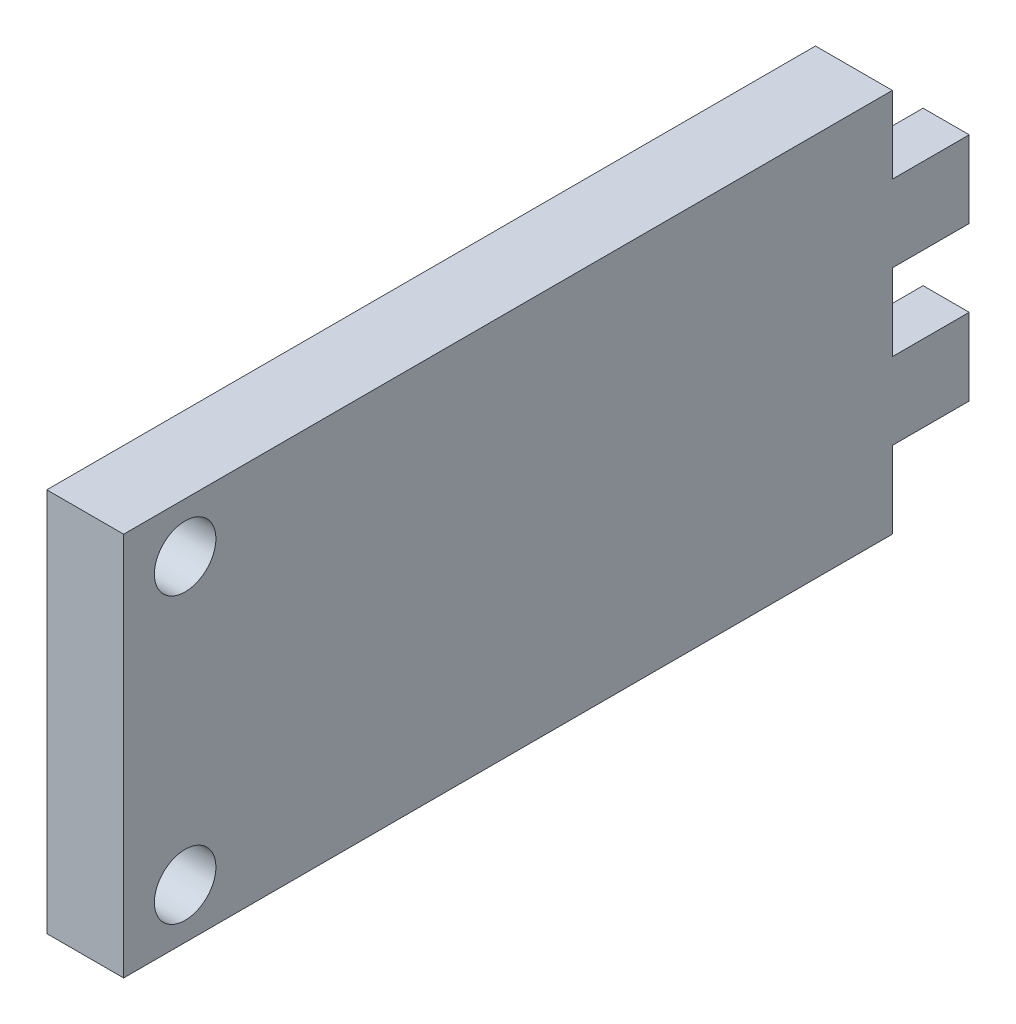
ISO-10303-21;
HEADER;
FILE_DESCRIPTION(('STEP AP214'),'2;1');
FILE_NAME('part.step','',(''),(''),'','','');
FILE_SCHEMA(('AUTOMOTIVE_DESIGN { 1 0 10303 214 1 1 1 1 }'));
ENDSEC;
DATA;
#1=APPLICATION_CONTEXT('core data for automotive mechanical design processes');
#2=APPLICATION_PROTOCOL_DEFINITION('international standard','automotive_design',2000,#1);
#3=PRODUCT_CONTEXT('',#1,'mechanical');
#4=PRODUCT('Part','Part','',(#3));
#5=PRODUCT_RELATED_PRODUCT_CATEGORY('part','',(#4));
#6=PRODUCT_DEFINITION_FORMATION('','',#4);
#7=PRODUCT_DEFINITION_CONTEXT('part definition',#1,'design');
#8=PRODUCT_DEFINITION('design','',#6,#7);
#9=PRODUCT_DEFINITION_SHAPE('','',#8);
#10=(LENGTH_UNIT() NAMED_UNIT(*) SI_UNIT(.MILLI.,.METRE.));
#11=(NAMED_UNIT(*) PLANE_ANGLE_UNIT() SI_UNIT($,.RADIAN.));
#12=(NAMED_UNIT(*) SI_UNIT($,.STERADIAN.) SOLID_ANGLE_UNIT());
#13=UNCERTAINTY_MEASURE_WITH_UNIT(LENGTH_MEASURE(1.E-05),#10,'distance_accuracy_value','');
#14=(GEOMETRIC_REPRESENTATION_CONTEXT(3) GLOBAL_UNCERTAINTY_ASSIGNED_CONTEXT((#13)) GLOBAL_UNIT_ASSIGNED_CONTEXT((#10,
#11,#12)) REPRESENTATION_CONTEXT('',''));
#15=CARTESIAN_POINT('',(0.,0.,0.));
#16=DIRECTION('',(0.,0.,1.));
#17=DIRECTION('',(1.,0.,0.));
#18=AXIS2_PLACEMENT_3D('',#15,#16,#17);
#19=CARTESIAN_POINT('',(0.,0.,0.));
#20=DIRECTION('',(0.,0.,-1.));
#21=DIRECTION('',(-1.,0.,0.));
#22=AXIS2_PLACEMENT_3D('',#19,#20,#21);
#23=PLANE('',#22);
#24=DIRECTION('',(0.,1.,0.));
#25=VECTOR('',#24,1.);
#26=CARTESIAN_POINT('',(11.1570247933884,10.6404958677686,0.));
#27=LINE('',#26,#25);
#28=CARTESIAN_POINT('',(11.1570247933884,-4.35950413223141,0.));
#29=VERTEX_POINT('',#28);
#30=CARTESIAN_POINT('',(11.1570247933884,0.640495867768589,0.));
#31=VERTEX_POINT('',#30);
#32=EDGE_CURVE('E206',#29,#31,#27,.T.);
#33=ORIENTED_EDGE('',*,*,#32,.F.);
#34=DIRECTION('',(1.,0.,0.));
#35=VECTOR('',#34,1.);
#36=CARTESIAN_POINT('',(8.15702479338845,-4.35950413223141,0.));
#37=LINE('',#36,#35);
#38=CARTESIAN_POINT('',(8.15702479338845,-4.35950413223141,0.));
#39=VERTEX_POINT('',#38);
#40=EDGE_CURVE('E386',#39,#29,#37,.T.);
#41=ORIENTED_EDGE('',*,*,#40,.F.);
#42=DIRECTION('',(0.,1.,0.));
#43=VECTOR('',#42,1.);
#44=CARTESIAN_POINT('',(8.15702479338845,-9.35950413223141,0.));
#45=LINE('',#44,#43);
#46=CARTESIAN_POINT('',(8.15702479338845,-9.35950413223141,0.));
#47=VERTEX_POINT('',#46);
#48=EDGE_CURVE('E145',#47,#39,#45,.T.);
#49=ORIENTED_EDGE('',*,*,#48,.F.);
#50=DIRECTION('',(-1.,0.,0.));
#51=VECTOR('',#50,1.);
#52=CARTESIAN_POINT('',(8.15702479338845,-9.35950413223141,0.));
#53=LINE('',#52,#51);
#54=CARTESIAN_POINT('',(11.1570247933884,-9.35950413223141,0.));
#55=VERTEX_POINT('',#54);
#56=EDGE_CURVE('E141',#55,#47,#53,.T.);
#57=ORIENTED_EDGE('',*,*,#56,.F.);
#58=CARTESIAN_POINT('',(11.1570247933884,-14.3595041322314,0.));
#59=VERTEX_POINT('',#58);
#60=EDGE_CURVE('E202',#59,#55,#27,.T.);
#61=ORIENTED_EDGE('',*,*,#60,.F.);
#62=DIRECTION('',(1.,0.,0.));
#63=VECTOR('',#62,1.);
#64=CARTESIAN_POINT('',(11.1570247933884,-14.3595041322314,0.));
#65=LINE('',#64,#63);
#66=CARTESIAN_POINT('',(6.15702479338845,-14.3595041322314,0.));
#67=VERTEX_POINT('',#66);
#68=EDGE_CURVE('E195',#67,#59,#65,.T.);
#69=ORIENTED_EDGE('',*,*,#68,.F.);
#70=DIRECTION('',(0.,-1.,0.));
#71=VECTOR('',#70,1.);
#72=CARTESIAN_POINT('',(6.15702479338845,10.6404958677686,0.));
#73=LINE('',#72,#71);
#74=CARTESIAN_POINT('',(6.15702479338845,10.6404958677686,0.));
#75=VERTEX_POINT('',#74);
#76=EDGE_CURVE('E208',#75,#67,#73,.T.);
#77=ORIENTED_EDGE('',*,*,#76,.F.);
#78=DIRECTION('',(-1.,0.,0.));
#79=VECTOR('',#78,1.);
#80=CARTESIAN_POINT('',(11.1570247933884,10.6404958677686,0.));
#81=LINE('',#80,#79);
#82=CARTESIAN_POINT('',(11.1570247933884,10.6404958677686,0.));
#83=VERTEX_POINT('',#82);
#84=EDGE_CURVE('E205',#83,#75,#81,.T.);
#85=ORIENTED_EDGE('',*,*,#84,.F.);
#86=CARTESIAN_POINT('',(11.1570247933884,5.63905003701848,0.));
#87=VERTEX_POINT('',#86);
#88=EDGE_CURVE('E190',#87,#83,#27,.T.);
#89=ORIENTED_EDGE('',*,*,#88,.F.);
#90=DIRECTION('',(1.,0.,0.));
#91=VECTOR('',#90,1.);
#92=CARTESIAN_POINT('',(11.1570247933884,5.63905003701848,0.));
#93=LINE('',#92,#91);
#94=CARTESIAN_POINT('',(8.15702479338845,5.63905003701848,0.));
#95=VERTEX_POINT('',#94);
#96=EDGE_CURVE('E56',#95,#87,#93,.T.);
#97=ORIENTED_EDGE('',*,*,#96,.F.);
#98=DIRECTION('',(0.,1.,0.));
#99=VECTOR('',#98,1.);
#100=CARTESIAN_POINT('',(8.15702479338845,5.63905003701848,0.));
#101=LINE('',#100,#99);
#102=CARTESIAN_POINT('',(8.15702479338845,0.640495867768589,0.));
#103=VERTEX_POINT('',#102);
#104=EDGE_CURVE('E150',#103,#95,#101,.T.);
#105=ORIENTED_EDGE('',*,*,#104,.F.);
#106=DIRECTION('',(-1.,0.,0.));
#107=VECTOR('',#106,1.);
#108=CARTESIAN_POINT('',(11.1570247933884,0.640495867768589,0.));
#109=LINE('',#108,#107);
#110=EDGE_CURVE('E147',#31,#103,#109,.T.);
#111=ORIENTED_EDGE('',*,*,#110,.F.);
#112=EDGE_LOOP('',(#33,#41,#49,#57,#61,#69,#77,#85,#89,#97,#105,#111));
#113=FACE_BOUND('',#112,.T.);
#114=ADVANCED_FACE('F33',(#113),#23,.T.);
#115=CARTESIAN_POINT('',(11.1570247933884,10.6404958677686,50.));
#116=DIRECTION('',(-1.,0.,0.));
#117=DIRECTION('',(0.,0.,1.));
#118=AXIS2_PLACEMENT_3D('',#115,#116,#117);
#119=PLANE('',#118);
#120=CARTESIAN_POINT('',(11.1570247933884,7.39049586776859,46.));
#121=DIRECTION('',(-1.,0.,0.));
#122=DIRECTION('',(0.,0.,1.));
#123=AXIS2_PLACEMENT_3D('',#120,#121,#122);
#124=CIRCLE('',#123,2.);
#125=CARTESIAN_POINT('',(11.1570247933884,7.39049586776859,48.));
#126=VERTEX_POINT('',#125);
#127=EDGE_CURVE('E187',#126,#126,#124,.T.);
#128=ORIENTED_EDGE('',*,*,#127,.T.);
#129=EDGE_LOOP('',(#128));
#130=FACE_BOUND('',#129,.T.);
#131=CARTESIAN_POINT('',(11.1570247933884,-11.1095041322314,46.));
#132=DIRECTION('',(-1.,0.,0.));
#133=DIRECTION('',(0.,0.,1.));
#134=AXIS2_PLACEMENT_3D('',#131,#132,#133);
#135=CIRCLE('',#134,2.);
#136=CARTESIAN_POINT('',(11.1570247933884,-11.1095041322314,48.));
#137=VERTEX_POINT('',#136);
#138=EDGE_CURVE('E182',#137,#137,#135,.T.);
#139=ORIENTED_EDGE('',*,*,#138,.T.);
#140=EDGE_LOOP('',(#139));
#141=FACE_BOUND('',#140,.T.);
#142=ORIENTED_EDGE('',*,*,#60,.T.);
#143=DIRECTION('',(0.,0.,1.));
#144=VECTOR('',#143,1.);
#145=CARTESIAN_POINT('',(11.1570247933884,-9.35950413223141,-5.));
#146=LINE('',#145,#144);
#147=CARTESIAN_POINT('',(11.1570247933884,-9.35950413223141,-5.));
#148=VERTEX_POINT('',#147);
#149=EDGE_CURVE('E48',#148,#55,#146,.T.);
#150=ORIENTED_EDGE('',*,*,#149,.F.);
#151=DIRECTION('',(0.,-1.,0.));
#152=VECTOR('',#151,1.);
#153=CARTESIAN_POINT('',(11.1570247933884,-9.35950413223141,-5.));
#154=LINE('',#153,#152);
#155=CARTESIAN_POINT('',(11.1570247933884,-4.35950413223141,-5.));
#156=VERTEX_POINT('',#155);
#157=EDGE_CURVE('E132',#156,#148,#154,.T.);
#158=ORIENTED_EDGE('',*,*,#157,.F.);
#159=DIRECTION('',(0.,0.,1.));
#160=VECTOR('',#159,1.);
#161=CARTESIAN_POINT('',(11.1570247933884,-4.35950413223141,-5.));
#162=LINE('',#161,#160);
#163=EDGE_CURVE('E129',#156,#29,#162,.T.);
#164=ORIENTED_EDGE('',*,*,#163,.T.);
#165=ORIENTED_EDGE('',*,*,#32,.T.);
#166=DIRECTION('',(0.,0.,1.));
#167=VECTOR('',#166,1.);
#168=CARTESIAN_POINT('',(11.1570247933884,0.640495867768589,-5.));
#169=LINE('',#168,#167);
#170=CARTESIAN_POINT('',(11.1570247933884,0.640495867768589,-5.));
#171=VERTEX_POINT('',#170);
#172=EDGE_CURVE('E175',#171,#31,#169,.T.);
#173=ORIENTED_EDGE('',*,*,#172,.F.);
#174=DIRECTION('',(0.,-1.,0.));
#175=VECTOR('',#174,1.);
#176=CARTESIAN_POINT('',(11.1570247933884,5.63905003701848,-5.));
#177=LINE('',#176,#175);
#178=CARTESIAN_POINT('',(11.1570247933884,5.63905003701848,-5.));
#179=VERTEX_POINT('',#178);
#180=EDGE_CURVE('E155',#179,#171,#177,.T.);
#181=ORIENTED_EDGE('',*,*,#180,.F.);
#182=DIRECTION('',(0.,0.,1.));
#183=VECTOR('',#182,1.);
#184=CARTESIAN_POINT('',(11.1570247933884,5.63905003701848,-5.));
#185=LINE('',#184,#183);
#186=EDGE_CURVE('E163',#179,#87,#185,.T.);
#187=ORIENTED_EDGE('',*,*,#186,.T.);
#188=ORIENTED_EDGE('',*,*,#88,.T.);
#189=DIRECTION('',(0.,0.,-1.));
#190=VECTOR('',#189,1.);
#191=CARTESIAN_POINT('',(11.1570247933884,10.6404958677686,50.));
#192=LINE('',#191,#190);
#193=CARTESIAN_POINT('',(11.1570247933884,10.6404958677686,50.));
#194=VERTEX_POINT('',#193);
#195=EDGE_CURVE('E11',#194,#83,#192,.T.);
#196=ORIENTED_EDGE('',*,*,#195,.F.);
#197=DIRECTION('',(0.,1.,0.));
#198=VECTOR('',#197,1.);
#199=CARTESIAN_POINT('',(11.1570247933884,10.6404958677686,50.));
#200=LINE('',#199,#198);
#201=CARTESIAN_POINT('',(11.1570247933884,-14.3595041322314,50.));
#202=VERTEX_POINT('',#201);
#203=EDGE_CURVE('E191',#202,#194,#200,.T.);
#204=ORIENTED_EDGE('',*,*,#203,.F.);
#205=DIRECTION('',(0.,0.,-1.));
#206=VECTOR('',#205,1.);
#207=CARTESIAN_POINT('',(11.1570247933884,-14.3595041322314,50.));
#208=LINE('',#207,#206);
#209=EDGE_CURVE('E201',#202,#59,#208,.T.);
#210=ORIENTED_EDGE('',*,*,#209,.T.);
#211=EDGE_LOOP('',(#142,#150,#158,#164,#165,#173,#181,#187,#188,#196,#204,#210));
#212=FACE_BOUND('',#211,.T.);
#213=ADVANCED_FACE('F35',(#130,#141,#212),#119,.F.);
#214=CARTESIAN_POINT('',(11.1570247933884,10.6404958677686,50.));
#215=DIRECTION('',(0.,-1.,0.));
#216=DIRECTION('',(0.,0.,-1.));
#217=AXIS2_PLACEMENT_3D('',#214,#215,#216);
#218=PLANE('',#217);
#219=ORIENTED_EDGE('',*,*,#84,.T.);
#220=DIRECTION('',(0.,0.,-1.));
#221=VECTOR('',#220,1.);
#222=CARTESIAN_POINT('',(6.15702479338845,10.6404958677686,50.));
#223=LINE('',#222,#221);
#224=CARTESIAN_POINT('',(6.15702479338845,10.6404958677686,50.));
#225=VERTEX_POINT('',#224);
#226=EDGE_CURVE('E41',#225,#75,#223,.T.);
#227=ORIENTED_EDGE('',*,*,#226,.F.);
#228=DIRECTION('',(-1.,0.,0.));
#229=VECTOR('',#228,1.);
#230=CARTESIAN_POINT('',(11.1570247933884,10.6404958677686,50.));
#231=LINE('',#230,#229);
#232=EDGE_CURVE('E194',#194,#225,#231,.T.);
#233=ORIENTED_EDGE('',*,*,#232,.F.);
#234=ORIENTED_EDGE('',*,*,#195,.T.);
#235=EDGE_LOOP('',(#219,#227,#233,#234));
#236=FACE_BOUND('',#235,.T.);
#237=ADVANCED_FACE('F236',(#236),#218,.F.);
#238=CARTESIAN_POINT('',(6.15702479338845,10.6404958677686,50.));
#239=DIRECTION('',(1.,0.,0.));
#240=DIRECTION('',(0.,1.,0.));
#241=AXIS2_PLACEMENT_3D('',#238,#239,#240);
#242=PLANE('',#241);
#243=CARTESIAN_POINT('',(6.15702479338845,7.39049586776859,46.));
#244=DIRECTION('',(-1.,0.,0.));
#245=DIRECTION('',(0.,-1.,0.));
#246=AXIS2_PLACEMENT_3D('',#243,#244,#245);
#247=CIRCLE('',#246,2.);
#248=CARTESIAN_POINT('',(6.15702479338845,5.39049586776859,46.));
#249=VERTEX_POINT('',#248);
#250=EDGE_CURVE('E179',#249,#249,#247,.T.);
#251=ORIENTED_EDGE('',*,*,#250,.F.);
#252=EDGE_LOOP('',(#251));
#253=FACE_BOUND('',#252,.T.);
#254=CARTESIAN_POINT('',(6.15702479338845,-11.1095041322314,46.));
#255=DIRECTION('',(-1.,0.,0.));
#256=DIRECTION('',(0.,-1.,0.));
#257=AXIS2_PLACEMENT_3D('',#254,#255,#256);
#258=CIRCLE('',#257,2.);
#259=CARTESIAN_POINT('',(6.15702479338845,-13.1095041322314,46.));
#260=VERTEX_POINT('',#259);
#261=EDGE_CURVE('E178',#260,#260,#258,.T.);
#262=ORIENTED_EDGE('',*,*,#261,.F.);
#263=EDGE_LOOP('',(#262));
#264=FACE_BOUND('',#263,.T.);
#265=ORIENTED_EDGE('',*,*,#76,.T.);
#266=DIRECTION('',(0.,0.,-1.));
#267=VECTOR('',#266,1.);
#268=CARTESIAN_POINT('',(6.15702479338845,-14.3595041322314,50.));
#269=LINE('',#268,#267);
#270=CARTESIAN_POINT('',(6.15702479338845,-14.3595041322314,50.));
#271=VERTEX_POINT('',#270);
#272=EDGE_CURVE('E213',#271,#67,#269,.T.);
#273=ORIENTED_EDGE('',*,*,#272,.F.);
#274=DIRECTION('',(0.,-1.,0.));
#275=VECTOR('',#274,1.);
#276=CARTESIAN_POINT('',(6.15702479338845,10.6404958677686,50.));
#277=LINE('',#276,#275);
#278=EDGE_CURVE('E197',#225,#271,#277,.T.);
#279=ORIENTED_EDGE('',*,*,#278,.F.);
#280=ORIENTED_EDGE('',*,*,#226,.T.);
#281=EDGE_LOOP('',(#265,#273,#279,#280));
#282=FACE_BOUND('',#281,.T.);
#283=ADVANCED_FACE('F220',(#253,#264,#282),#242,.F.);
#284=CARTESIAN_POINT('',(11.1570247933884,-14.3595041322314,50.));
#285=DIRECTION('',(0.,1.,0.));
#286=DIRECTION('',(0.,0.,1.));
#287=AXIS2_PLACEMENT_3D('',#284,#285,#286);
#288=PLANE('',#287);
#289=ORIENTED_EDGE('',*,*,#68,.T.);
#290=ORIENTED_EDGE('',*,*,#209,.F.);
#291=DIRECTION('',(1.,0.,0.));
#292=VECTOR('',#291,1.);
#293=CARTESIAN_POINT('',(11.1570247933884,-14.3595041322314,50.));
#294=LINE('',#293,#292);
#295=EDGE_CURVE('E199',#271,#202,#294,.T.);
#296=ORIENTED_EDGE('',*,*,#295,.F.);
#297=ORIENTED_EDGE('',*,*,#272,.T.);
#298=EDGE_LOOP('',(#289,#290,#296,#297));
#299=FACE_BOUND('',#298,.T.);
#300=ADVANCED_FACE('F229',(#299),#288,.F.);
#301=CARTESIAN_POINT('',(0.,0.,50.));
#302=DIRECTION('',(0.,0.,-1.));
#303=DIRECTION('',(-1.,0.,0.));
#304=AXIS2_PLACEMENT_3D('',#301,#302,#303);
#305=PLANE('',#304);
#306=ORIENTED_EDGE('',*,*,#203,.T.);
#307=ORIENTED_EDGE('',*,*,#232,.T.);
#308=ORIENTED_EDGE('',*,*,#278,.T.);
#309=ORIENTED_EDGE('',*,*,#295,.T.);
#310=EDGE_LOOP('',(#306,#307,#308,#309));
#311=FACE_BOUND('',#310,.T.);
#312=ADVANCED_FACE('F235',(#311),#305,.F.);
#313=CARTESIAN_POINT('',(21.1570247933884,-11.1095041322314,46.));
#314=DIRECTION('',(-1.,0.,0.));
#315=DIRECTION('',(0.,-1.,0.));
#316=AXIS2_PLACEMENT_3D('',#313,#314,#315);
#317=CYLINDRICAL_SURFACE('',#316,2.);
#318=ORIENTED_EDGE('',*,*,#261,.T.);
#319=EDGE_LOOP('',(#318));
#320=FACE_BOUND('',#319,.T.);
#321=ORIENTED_EDGE('',*,*,#138,.F.);
#322=EDGE_LOOP('',(#321));
#323=FACE_BOUND('',#322,.T.);
#324=ADVANCED_FACE('F259',(#320,#323),#317,.F.);
#325=CARTESIAN_POINT('',(21.1570247933884,7.3904958677686,46.));
#326=DIRECTION('',(-1.,0.,0.));
#327=DIRECTION('',(0.,-1.,0.));
#328=AXIS2_PLACEMENT_3D('',#325,#326,#327);
#329=CYLINDRICAL_SURFACE('',#328,2.);
#330=ORIENTED_EDGE('',*,*,#250,.T.);
#331=EDGE_LOOP('',(#330));
#332=FACE_BOUND('',#331,.T.);
#333=ORIENTED_EDGE('',*,*,#127,.F.);
#334=EDGE_LOOP('',(#333));
#335=FACE_BOUND('',#334,.T.);
#336=ADVANCED_FACE('F263',(#332,#335),#329,.F.);
#337=CARTESIAN_POINT('',(11.1570247933884,0.640495867768589,-5.));
#338=DIRECTION('',(0.,1.,0.));
#339=DIRECTION('',(0.,0.,1.));
#340=AXIS2_PLACEMENT_3D('',#337,#338,#339);
#341=PLANE('',#340);
#342=ORIENTED_EDGE('',*,*,#110,.T.);
#343=DIRECTION('',(0.,0.,1.));
#344=VECTOR('',#343,1.);
#345=CARTESIAN_POINT('',(8.15702479338845,0.640495867768589,-5.));
#346=LINE('',#345,#344);
#347=CARTESIAN_POINT('',(8.15702479338845,0.640495867768589,-5.));
#348=VERTEX_POINT('',#347);
#349=EDGE_CURVE('E172',#348,#103,#346,.T.);
#350=ORIENTED_EDGE('',*,*,#349,.F.);
#351=DIRECTION('',(-1.,0.,0.));
#352=VECTOR('',#351,1.);
#353=CARTESIAN_POINT('',(11.1570247933884,0.640495867768589,-5.));
#354=LINE('',#353,#352);
#355=EDGE_CURVE('E158',#171,#348,#354,.T.);
#356=ORIENTED_EDGE('',*,*,#355,.F.);
#357=ORIENTED_EDGE('',*,*,#172,.T.);
#358=EDGE_LOOP('',(#342,#350,#356,#357));
#359=FACE_BOUND('',#358,.T.);
#360=ADVANCED_FACE('F268',(#359),#341,.F.);
#361=CARTESIAN_POINT('',(8.15702479338845,5.63905003701848,-5.));
#362=DIRECTION('',(1.,0.,0.));
#363=DIRECTION('',(0.,0.,-1.));
#364=AXIS2_PLACEMENT_3D('',#361,#362,#363);
#365=PLANE('',#364);
#366=ORIENTED_EDGE('',*,*,#104,.T.);
#367=DIRECTION('',(0.,0.,1.));
#368=VECTOR('',#367,1.);
#369=CARTESIAN_POINT('',(8.15702479338845,5.63905003701848,-5.));
#370=LINE('',#369,#368);
#371=CARTESIAN_POINT('',(8.15702479338845,5.63905003701848,-5.));
#372=VERTEX_POINT('',#371);
#373=EDGE_CURVE('E169',#372,#95,#370,.T.);
#374=ORIENTED_EDGE('',*,*,#373,.F.);
#375=DIRECTION('',(0.,1.,0.));
#376=VECTOR('',#375,1.);
#377=CARTESIAN_POINT('',(8.15702479338845,5.63905003701848,-5.));
#378=LINE('',#377,#376);
#379=EDGE_CURVE('E160',#348,#372,#378,.T.);
#380=ORIENTED_EDGE('',*,*,#379,.F.);
#381=ORIENTED_EDGE('',*,*,#349,.T.);
#382=EDGE_LOOP('',(#366,#374,#380,#381));
#383=FACE_BOUND('',#382,.T.);
#384=ADVANCED_FACE('F275',(#383),#365,.F.);
#385=CARTESIAN_POINT('',(11.1570247933884,5.63905003701848,-5.));
#386=DIRECTION('',(0.,-1.,0.));
#387=DIRECTION('',(0.,0.,-1.));
#388=AXIS2_PLACEMENT_3D('',#385,#386,#387);
#389=PLANE('',#388);
#390=ORIENTED_EDGE('',*,*,#96,.T.);
#391=ORIENTED_EDGE('',*,*,#186,.F.);
#392=DIRECTION('',(1.,0.,0.));
#393=VECTOR('',#392,1.);
#394=CARTESIAN_POINT('',(11.1570247933884,5.63905003701848,-5.));
#395=LINE('',#394,#393);
#396=EDGE_CURVE('E162',#372,#179,#395,.T.);
#397=ORIENTED_EDGE('',*,*,#396,.F.);
#398=ORIENTED_EDGE('',*,*,#373,.T.);
#399=EDGE_LOOP('',(#390,#391,#397,#398));
#400=FACE_BOUND('',#399,.T.);
#401=ADVANCED_FACE('F279',(#400),#389,.F.);
#402=CARTESIAN_POINT('',(0.,0.,-5.));
#403=DIRECTION('',(0.,0.,-1.));
#404=DIRECTION('',(-1.,0.,0.));
#405=AXIS2_PLACEMENT_3D('',#402,#403,#404);
#406=PLANE('',#405);
#407=ORIENTED_EDGE('',*,*,#180,.T.);
#408=ORIENTED_EDGE('',*,*,#355,.T.);
#409=ORIENTED_EDGE('',*,*,#379,.T.);
#410=ORIENTED_EDGE('',*,*,#396,.T.);
#411=EDGE_LOOP('',(#407,#408,#409,#410));
#412=FACE_BOUND('',#411,.T.);
#413=ADVANCED_FACE('F283',(#412),#406,.T.);
#414=CARTESIAN_POINT('',(8.15702479338845,-9.35950413223141,-5.));
#415=DIRECTION('',(1.,0.,0.));
#416=DIRECTION('',(0.,0.,-1.));
#417=AXIS2_PLACEMENT_3D('',#414,#415,#416);
#418=PLANE('',#417);
#419=ORIENTED_EDGE('',*,*,#48,.T.);
#420=DIRECTION('',(0.,0.,1.));
#421=VECTOR('',#420,1.);
#422=CARTESIAN_POINT('',(8.15702479338845,-4.35950413223141,-5.));
#423=LINE('',#422,#421);
#424=CARTESIAN_POINT('',(8.15702479338845,-4.35950413223141,-5.));
#425=VERTEX_POINT('',#424);
#426=EDGE_CURVE('E126',#425,#39,#423,.T.);
#427=ORIENTED_EDGE('',*,*,#426,.F.);
#428=DIRECTION('',(0.,1.,0.));
#429=VECTOR('',#428,1.);
#430=CARTESIAN_POINT('',(8.15702479338845,-9.35950413223141,-5.));
#431=LINE('',#430,#429);
#432=CARTESIAN_POINT('',(8.15702479338845,-9.35950413223141,-5.));
#433=VERTEX_POINT('',#432);
#434=EDGE_CURVE('E133',#433,#425,#431,.T.);
#435=ORIENTED_EDGE('',*,*,#434,.F.);
#436=DIRECTION('',(0.,0.,1.));
#437=VECTOR('',#436,1.);
#438=CARTESIAN_POINT('',(8.15702479338845,-9.35950413223141,-5.));
#439=LINE('',#438,#437);
#440=EDGE_CURVE('E385',#433,#47,#439,.T.);
#441=ORIENTED_EDGE('',*,*,#440,.T.);
#442=EDGE_LOOP('',(#419,#427,#435,#441));
#443=FACE_BOUND('',#442,.T.);
#444=ADVANCED_FACE('F143',(#443),#418,.F.);
#445=CARTESIAN_POINT('',(8.15702479338845,-4.35950413223141,-5.));
#446=DIRECTION('',(0.,-1.,0.));
#447=DIRECTION('',(0.,0.,-1.));
#448=AXIS2_PLACEMENT_3D('',#445,#446,#447);
#449=PLANE('',#448);
#450=ORIENTED_EDGE('',*,*,#40,.T.);
#451=ORIENTED_EDGE('',*,*,#163,.F.);
#452=DIRECTION('',(1.,0.,0.));
#453=VECTOR('',#452,1.);
#454=CARTESIAN_POINT('',(8.15702479338845,-4.35950413223141,-5.));
#455=LINE('',#454,#453);
#456=EDGE_CURVE('E122',#425,#156,#455,.T.);
#457=ORIENTED_EDGE('',*,*,#456,.F.);
#458=ORIENTED_EDGE('',*,*,#426,.T.);
#459=EDGE_LOOP('',(#450,#451,#457,#458));
#460=FACE_BOUND('',#459,.T.);
#461=ADVANCED_FACE('F124',(#460),#449,.F.);
#462=CARTESIAN_POINT('',(8.15702479338845,-9.35950413223141,-5.));
#463=DIRECTION('',(0.,1.,0.));
#464=DIRECTION('',(0.,0.,1.));
#465=AXIS2_PLACEMENT_3D('',#462,#463,#464);
#466=PLANE('',#465);
#467=ORIENTED_EDGE('',*,*,#56,.T.);
#468=ORIENTED_EDGE('',*,*,#440,.F.);
#469=DIRECTION('',(-1.,0.,0.));
#470=VECTOR('',#469,1.);
#471=CARTESIAN_POINT('',(8.15702479338845,-9.35950413223141,-5.));
#472=LINE('',#471,#470);
#473=EDGE_CURVE('E137',#148,#433,#472,.T.);
#474=ORIENTED_EDGE('',*,*,#473,.F.);
#475=ORIENTED_EDGE('',*,*,#149,.T.);
#476=EDGE_LOOP('',(#467,#468,#474,#475));
#477=FACE_BOUND('',#476,.T.);
#478=ADVANCED_FACE('F292',(#477),#466,.F.);
#479=CARTESIAN_POINT('',(0.,0.,-5.));
#480=DIRECTION('',(0.,0.,-1.));
#481=DIRECTION('',(-1.,0.,0.));
#482=AXIS2_PLACEMENT_3D('',#479,#480,#481);
#483=PLANE('',#482);
#484=ORIENTED_EDGE('',*,*,#434,.T.);
#485=ORIENTED_EDGE('',*,*,#456,.T.);
#486=ORIENTED_EDGE('',*,*,#157,.T.);
#487=ORIENTED_EDGE('',*,*,#473,.T.);
#488=EDGE_LOOP('',(#484,#485,#486,#487));
#489=FACE_BOUND('',#488,.T.);
#490=ADVANCED_FACE('F136',(#489),#483,.T.);
#491=CLOSED_SHELL('',(#114,#213,#237,#283,#300,#312,#324,#336,#360,#384,#401,#413,#444,#461,
#478,#490));
#492=MANIFOLD_SOLID_BREP('B2',#491);
#493=ADVANCED_BREP_SHAPE_REPRESENTATION('',(#18,#492),#14);
#494=SHAPE_DEFINITION_REPRESENTATION(#9,#493);
ENDSEC;
END-ISO-10303-21;
